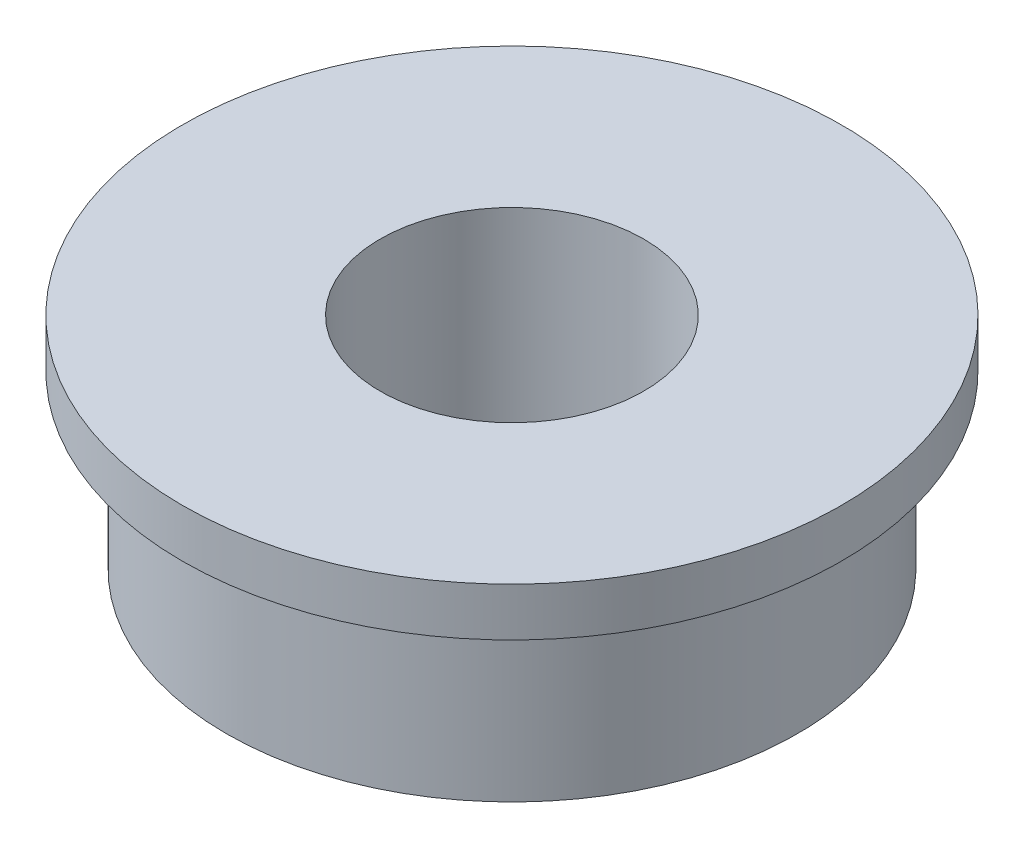
ISO-10303-21;
HEADER;
FILE_DESCRIPTION(('STEP AP214'),'2;1');
FILE_NAME('part.step','',(''),(''),'','','');
FILE_SCHEMA(('AUTOMOTIVE_DESIGN { 1 0 10303 214 1 1 1 1 }'));
ENDSEC;
DATA;
#1=APPLICATION_CONTEXT('core data for automotive mechanical design processes');
#2=APPLICATION_PROTOCOL_DEFINITION('international standard','automotive_design',2000,#1);
#3=PRODUCT_CONTEXT('',#1,'mechanical');
#4=PRODUCT('Part','Part','',(#3));
#5=PRODUCT_RELATED_PRODUCT_CATEGORY('part','',(#4));
#6=PRODUCT_DEFINITION_FORMATION('','',#4);
#7=PRODUCT_DEFINITION_CONTEXT('part definition',#1,'design');
#8=PRODUCT_DEFINITION('design','',#6,#7);
#9=PRODUCT_DEFINITION_SHAPE('','',#8);
#10=(LENGTH_UNIT() NAMED_UNIT(*) SI_UNIT(.MILLI.,.METRE.));
#11=(NAMED_UNIT(*) PLANE_ANGLE_UNIT() SI_UNIT($,.RADIAN.));
#12=(NAMED_UNIT(*) SI_UNIT($,.STERADIAN.) SOLID_ANGLE_UNIT());
#13=UNCERTAINTY_MEASURE_WITH_UNIT(LENGTH_MEASURE(1.E-05),#10,'distance_accuracy_value','');
#14=(GEOMETRIC_REPRESENTATION_CONTEXT(3) GLOBAL_UNCERTAINTY_ASSIGNED_CONTEXT((#13)) GLOBAL_UNIT_ASSIGNED_CONTEXT((#10,
#11,#12)) REPRESENTATION_CONTEXT('',''));
#15=CARTESIAN_POINT('',(0.,0.,0.));
#16=DIRECTION('',(0.,0.,1.));
#17=DIRECTION('',(1.,0.,0.));
#18=AXIS2_PLACEMENT_3D('',#15,#16,#17);
#19=CARTESIAN_POINT('',(0.,2.5,0.));
#20=DIRECTION('',(0.,-1.,0.));
#21=DIRECTION('',(0.,0.,-1.));
#22=AXIS2_PLACEMENT_3D('',#19,#20,#21);
#23=CYLINDRICAL_SURFACE('',#22,6.5);
#24=CARTESIAN_POINT('',(0.,-2.5,0.));
#25=DIRECTION('',(0.,1.,0.));
#26=DIRECTION('',(0.,0.,1.));
#27=AXIS2_PLACEMENT_3D('',#24,#25,#26);
#28=CIRCLE('',#27,6.5);
#29=CARTESIAN_POINT('',(0.,-2.5,6.5));
#30=VERTEX_POINT('',#29);
#31=EDGE_CURVE('E44',#30,#30,#28,.T.);
#32=ORIENTED_EDGE('',*,*,#31,.T.);
#33=EDGE_LOOP('',(#32));
#34=FACE_BOUND('',#33,.T.);
#35=CARTESIAN_POINT('',(0.,1.4,0.));
#36=DIRECTION('',(0.,1.,0.));
#37=DIRECTION('',(0.,0.,1.));
#38=AXIS2_PLACEMENT_3D('',#35,#36,#37);
#39=CIRCLE('',#38,6.5);
#40=CARTESIAN_POINT('',(0.,1.4,6.5));
#41=VERTEX_POINT('',#40);
#42=EDGE_CURVE('E10',#41,#41,#39,.T.);
#43=ORIENTED_EDGE('',*,*,#42,.F.);
#44=EDGE_LOOP('',(#43));
#45=FACE_BOUND('',#44,.T.);
#46=ADVANCED_FACE('F37',(#34,#45),#23,.T.);
#47=CARTESIAN_POINT('',(0.,-2.5,0.));
#48=DIRECTION('',(0.,1.,0.));
#49=DIRECTION('',(0.,0.,1.));
#50=AXIS2_PLACEMENT_3D('',#47,#48,#49);
#51=PLANE('',#50);
#52=CARTESIAN_POINT('',(0.,-2.5,0.));
#53=DIRECTION('',(0.,-1.,0.));
#54=DIRECTION('',(0.,0.,-1.));
#55=AXIS2_PLACEMENT_3D('',#52,#53,#54);
#56=CIRCLE('',#55,3.);
#57=CARTESIAN_POINT('',(0.,-2.5,-3.));
#58=VERTEX_POINT('',#57);
#59=EDGE_CURVE('E61',#58,#58,#56,.T.);
#60=ORIENTED_EDGE('',*,*,#59,.F.);
#61=EDGE_LOOP('',(#60));
#62=FACE_BOUND('',#61,.T.);
#63=ORIENTED_EDGE('',*,*,#31,.F.);
#64=EDGE_LOOP('',(#63));
#65=FACE_BOUND('',#64,.T.);
#66=ADVANCED_FACE('F78',(#62,#65),#51,.F.);
#67=CARTESIAN_POINT('',(0.,1.4,0.));
#68=DIRECTION('',(0.,1.,0.));
#69=DIRECTION('',(0.,0.,1.));
#70=AXIS2_PLACEMENT_3D('',#67,#68,#69);
#71=CYLINDRICAL_SURFACE('',#70,7.5);
#72=CARTESIAN_POINT('',(0.,1.4,0.));
#73=DIRECTION('',(0.,1.,0.));
#74=DIRECTION('',(0.,0.,1.));
#75=AXIS2_PLACEMENT_3D('',#72,#73,#74);
#76=CIRCLE('',#75,7.5);
#77=CARTESIAN_POINT('',(0.,1.4,7.5));
#78=VERTEX_POINT('',#77);
#79=EDGE_CURVE('E49',#78,#78,#76,.T.);
#80=ORIENTED_EDGE('',*,*,#79,.T.);
#81=EDGE_LOOP('',(#80));
#82=FACE_BOUND('',#81,.T.);
#83=CARTESIAN_POINT('',(0.,2.5,0.));
#84=DIRECTION('',(0.,1.,0.));
#85=DIRECTION('',(0.,0.,1.));
#86=AXIS2_PLACEMENT_3D('',#83,#84,#85);
#87=CIRCLE('',#86,7.5);
#88=CARTESIAN_POINT('',(0.,2.5,7.5));
#89=VERTEX_POINT('',#88);
#90=EDGE_CURVE('E54',#89,#89,#87,.T.);
#91=ORIENTED_EDGE('',*,*,#90,.F.);
#92=EDGE_LOOP('',(#91));
#93=FACE_BOUND('',#92,.T.);
#94=ADVANCED_FACE('F81',(#82,#93),#71,.T.);
#95=CARTESIAN_POINT('',(0.,1.4,0.));
#96=DIRECTION('',(0.,1.,0.));
#97=DIRECTION('',(0.,0.,1.));
#98=AXIS2_PLACEMENT_3D('',#95,#96,#97);
#99=PLANE('',#98);
#100=ORIENTED_EDGE('',*,*,#42,.T.);
#101=EDGE_LOOP('',(#100));
#102=FACE_BOUND('',#101,.T.);
#103=ORIENTED_EDGE('',*,*,#79,.F.);
#104=EDGE_LOOP('',(#103));
#105=FACE_BOUND('',#104,.T.);
#106=ADVANCED_FACE('F86',(#102,#105),#99,.F.);
#107=CARTESIAN_POINT('',(0.,2.5,0.));
#108=DIRECTION('',(0.,1.,0.));
#109=DIRECTION('',(0.,0.,1.));
#110=AXIS2_PLACEMENT_3D('',#107,#108,#109);
#111=PLANE('',#110);
#112=CARTESIAN_POINT('',(0.,2.5,0.));
#113=DIRECTION('',(0.,-1.,0.));
#114=DIRECTION('',(0.,0.,-1.));
#115=AXIS2_PLACEMENT_3D('',#112,#113,#114);
#116=CIRCLE('',#115,3.);
#117=CARTESIAN_POINT('',(0.,2.5,-3.));
#118=VERTEX_POINT('',#117);
#119=EDGE_CURVE('E59',#118,#118,#116,.T.);
#120=ORIENTED_EDGE('',*,*,#119,.T.);
#121=EDGE_LOOP('',(#120));
#122=FACE_BOUND('',#121,.T.);
#123=ORIENTED_EDGE('',*,*,#90,.T.);
#124=EDGE_LOOP('',(#123));
#125=FACE_BOUND('',#124,.T.);
#126=ADVANCED_FACE('F69',(#122,#125),#111,.T.);
#127=CARTESIAN_POINT('',(0.,2.5,0.));
#128=DIRECTION('',(0.,-1.,0.));
#129=DIRECTION('',(0.,0.,-1.));
#130=AXIS2_PLACEMENT_3D('',#127,#128,#129);
#131=CYLINDRICAL_SURFACE('',#130,3.);
#132=ORIENTED_EDGE('',*,*,#119,.F.);
#133=EDGE_LOOP('',(#132));
#134=FACE_BOUND('',#133,.T.);
#135=ORIENTED_EDGE('',*,*,#59,.T.);
#136=EDGE_LOOP('',(#135));
#137=FACE_BOUND('',#136,.T.);
#138=ADVANCED_FACE('F72',(#134,#137),#131,.F.);
#139=CLOSED_SHELL('',(#46,#66,#94,#106,#126,#138));
#140=MANIFOLD_SOLID_BREP('B2',#139);
#141=ADVANCED_BREP_SHAPE_REPRESENTATION('',(#18,#140),#14);
#142=SHAPE_DEFINITION_REPRESENTATION(#9,#141);
ENDSEC;
END-ISO-10303-21;
